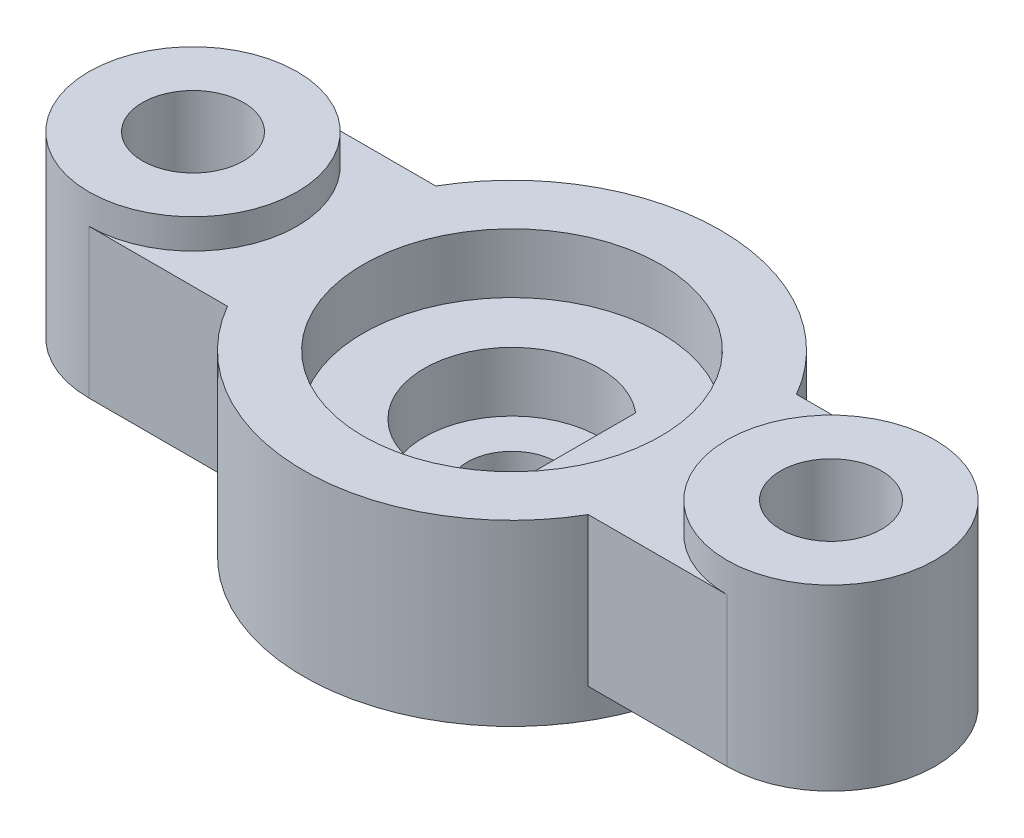
ISO-10303-21;
HEADER;
FILE_DESCRIPTION(('STEP AP214'),'2;1');
FILE_NAME('part.step','',(''),(''),'','','');
FILE_SCHEMA(('AUTOMOTIVE_DESIGN { 1 0 10303 214 1 1 1 1 }'));
ENDSEC;
DATA;
#1=APPLICATION_CONTEXT('core data for automotive mechanical design processes');
#2=APPLICATION_PROTOCOL_DEFINITION('international standard','automotive_design',2000,#1);
#3=PRODUCT_CONTEXT('',#1,'mechanical');
#4=PRODUCT('Part','Part','',(#3));
#5=PRODUCT_RELATED_PRODUCT_CATEGORY('part','',(#4));
#6=PRODUCT_DEFINITION_FORMATION('','',#4);
#7=PRODUCT_DEFINITION_CONTEXT('part definition',#1,'design');
#8=PRODUCT_DEFINITION('design','',#6,#7);
#9=PRODUCT_DEFINITION_SHAPE('','',#8);
#10=(LENGTH_UNIT() NAMED_UNIT(*) SI_UNIT(.MILLI.,.METRE.));
#11=(NAMED_UNIT(*) PLANE_ANGLE_UNIT() SI_UNIT($,.RADIAN.));
#12=(NAMED_UNIT(*) SI_UNIT($,.STERADIAN.) SOLID_ANGLE_UNIT());
#13=UNCERTAINTY_MEASURE_WITH_UNIT(LENGTH_MEASURE(1.E-05),#10,'distance_accuracy_value','');
#14=(GEOMETRIC_REPRESENTATION_CONTEXT(3) GLOBAL_UNCERTAINTY_ASSIGNED_CONTEXT((#13)) GLOBAL_UNIT_ASSIGNED_CONTEXT((#10,
#11,#12)) REPRESENTATION_CONTEXT('',''));
#15=CARTESIAN_POINT('',(0.,0.,0.));
#16=DIRECTION('',(0.,0.,1.));
#17=DIRECTION('',(1.,0.,0.));
#18=AXIS2_PLACEMENT_3D('',#15,#16,#17);
#19=CARTESIAN_POINT('',(0.,3.,0.));
#20=DIRECTION('',(0.,-1.,0.));
#21=DIRECTION('',(0.,0.,-1.));
#22=AXIS2_PLACEMENT_3D('',#19,#20,#21);
#23=CYLINDRICAL_SURFACE('',#22,1.5);
#24=CARTESIAN_POINT('',(0.,-1.,0.));
#25=DIRECTION('',(0.,-1.,0.));
#26=DIRECTION('',(0.,0.,-1.));
#27=AXIS2_PLACEMENT_3D('',#24,#25,#26);
#28=CIRCLE('',#27,1.5);
#29=CARTESIAN_POINT('',(0.,-1.,-1.5));
#30=VERTEX_POINT('',#29);
#31=EDGE_CURVE('E168',#30,#30,#28,.T.);
#32=ORIENTED_EDGE('',*,*,#31,.T.);
#33=EDGE_LOOP('',(#32));
#34=FACE_BOUND('',#33,.T.);
#35=CARTESIAN_POINT('',(0.,1.,0.));
#36=DIRECTION('',(0.,1.,0.));
#37=DIRECTION('',(0.,0.,1.));
#38=AXIS2_PLACEMENT_3D('',#35,#36,#37);
#39=CIRCLE('',#38,1.5);
#40=CARTESIAN_POINT('',(0.,1.,1.5));
#41=VERTEX_POINT('',#40);
#42=EDGE_CURVE('E37',#41,#41,#39,.F.);
#43=ORIENTED_EDGE('',*,*,#42,.F.);
#44=EDGE_LOOP('',(#43));
#45=FACE_BOUND('',#44,.T.);
#46=ADVANCED_FACE('F33',(#34,#45),#23,.F.);
#47=CARTESIAN_POINT('',(0.,0.,0.));
#48=DIRECTION('',(0.,1.,0.));
#49=DIRECTION('',(0.,0.,1.));
#50=AXIS2_PLACEMENT_3D('',#47,#48,#49);
#51=PLANE('',#50);
#52=CARTESIAN_POINT('',(10.72,0.,0.));
#53=DIRECTION('',(0.,1.,0.));
#54=DIRECTION('',(0.,0.,1.));
#55=AXIS2_PLACEMENT_3D('',#52,#53,#54);
#56=CIRCLE('',#55,1.7);
#57=CARTESIAN_POINT('',(10.72,0.,1.7));
#58=VERTEX_POINT('',#57);
#59=EDGE_CURVE('E196',#58,#58,#56,.T.);
#60=ORIENTED_EDGE('',*,*,#59,.T.);
#61=EDGE_LOOP('',(#60));
#62=FACE_BOUND('',#61,.T.);
#63=DIRECTION('',(1.,0.,0.));
#64=VECTOR('',#63,1.);
#65=CARTESIAN_POINT('',(10.72,0.,3.5));
#66=LINE('',#65,#64);
#67=CARTESIAN_POINT('',(6.06217782649107,0.,3.5));
#68=VERTEX_POINT('',#67);
#69=CARTESIAN_POINT('',(10.72,0.,3.5));
#70=VERTEX_POINT('',#69);
#71=EDGE_CURVE('E135',#68,#70,#66,.T.);
#72=ORIENTED_EDGE('',*,*,#71,.F.);
#73=CARTESIAN_POINT('',(0.,0.,0.));
#74=DIRECTION('',(0.,1.,0.));
#75=DIRECTION('',(0.,0.,1.));
#76=AXIS2_PLACEMENT_3D('',#73,#74,#75);
#77=CIRCLE('',#76,7.);
#78=CARTESIAN_POINT('',(6.06217782649107,0.,-3.5));
#79=VERTEX_POINT('',#78);
#80=EDGE_CURVE('E161',#68,#79,#77,.T.);
#81=ORIENTED_EDGE('',*,*,#80,.T.);
#82=DIRECTION('',(-1.,0.,0.));
#83=VECTOR('',#82,1.);
#84=CARTESIAN_POINT('',(10.72,0.,-3.5));
#85=LINE('',#84,#83);
#86=CARTESIAN_POINT('',(10.72,0.,-3.5));
#87=VERTEX_POINT('',#86);
#88=EDGE_CURVE('E140',#87,#79,#85,.T.);
#89=ORIENTED_EDGE('',*,*,#88,.F.);
#90=CARTESIAN_POINT('',(10.72,0.,0.));
#91=DIRECTION('',(0.,1.,0.));
#92=DIRECTION('',(0.,0.,1.));
#93=AXIS2_PLACEMENT_3D('',#90,#91,#92);
#94=CIRCLE('',#93,3.5);
#95=EDGE_CURVE('E137',#70,#87,#94,.T.);
#96=ORIENTED_EDGE('',*,*,#95,.F.);
#97=EDGE_LOOP('',(#72,#81,#89,#96));
#98=FACE_BOUND('',#97,.T.);
#99=ADVANCED_FACE('F216',(#62,#98),#51,.F.);
#100=CARTESIAN_POINT('',(0.,5.,0.));
#101=DIRECTION('',(0.,-1.,0.));
#102=DIRECTION('',(0.,0.,-1.));
#103=AXIS2_PLACEMENT_3D('',#100,#101,#102);
#104=CYLINDRICAL_SURFACE('',#103,5.);
#105=CARTESIAN_POINT('',(0.,5.,0.));
#106=DIRECTION('',(0.,1.,0.));
#107=DIRECTION('',(0.,0.,1.));
#108=AXIS2_PLACEMENT_3D('',#105,#106,#107);
#109=CIRCLE('',#108,5.);
#110=CARTESIAN_POINT('',(0.,5.,5.));
#111=VERTEX_POINT('',#110);
#112=EDGE_CURVE('E138',#111,#111,#109,.T.);
#113=ORIENTED_EDGE('',*,*,#112,.T.);
#114=EDGE_LOOP('',(#113));
#115=FACE_BOUND('',#114,.T.);
#116=CARTESIAN_POINT('',(0.,3.,0.));
#117=DIRECTION('',(0.,-1.,0.));
#118=DIRECTION('',(0.,0.,-1.));
#119=AXIS2_PLACEMENT_3D('',#116,#117,#118);
#120=CIRCLE('',#119,5.);
#121=CARTESIAN_POINT('',(0.,3.,-5.));
#122=VERTEX_POINT('',#121);
#123=EDGE_CURVE('E159',#122,#122,#120,.T.);
#124=ORIENTED_EDGE('',*,*,#123,.T.);
#125=EDGE_LOOP('',(#124));
#126=FACE_BOUND('',#125,.T.);
#127=ADVANCED_FACE('F258',(#115,#126),#104,.F.);
#128=CARTESIAN_POINT('',(0.,5.,0.));
#129=DIRECTION('',(0.,1.,0.));
#130=DIRECTION('',(0.,0.,1.));
#131=AXIS2_PLACEMENT_3D('',#128,#129,#130);
#132=PLANE('',#131);
#133=ORIENTED_EDGE('',*,*,#112,.F.);
#134=EDGE_LOOP('',(#133));
#135=FACE_BOUND('',#134,.T.);
#136=DIRECTION('',(1.,0.,0.));
#137=VECTOR('',#136,1.);
#138=CARTESIAN_POINT('',(10.72,5.,3.5));
#139=LINE('',#138,#137);
#140=CARTESIAN_POINT('',(6.06217782649107,5.,3.5));
#141=VERTEX_POINT('',#140);
#142=CARTESIAN_POINT('',(10.72,5.,3.5));
#143=VERTEX_POINT('',#142);
#144=EDGE_CURVE('E92',#141,#143,#139,.T.);
#145=ORIENTED_EDGE('',*,*,#144,.T.);
#146=CARTESIAN_POINT('',(10.72,5.,0.));
#147=DIRECTION('',(0.,1.,0.));
#148=DIRECTION('',(0.,0.,1.));
#149=AXIS2_PLACEMENT_3D('',#146,#147,#148);
#150=CIRCLE('',#149,3.5);
#151=CARTESIAN_POINT('',(10.72,5.,-3.5));
#152=VERTEX_POINT('',#151);
#153=EDGE_CURVE('E179',#152,#143,#150,.T.);
#154=ORIENTED_EDGE('',*,*,#153,.F.);
#155=DIRECTION('',(-1.,0.,0.));
#156=VECTOR('',#155,1.);
#157=CARTESIAN_POINT('',(10.72,5.,-3.5));
#158=LINE('',#157,#156);
#159=CARTESIAN_POINT('',(6.06217782649107,5.,-3.5));
#160=VERTEX_POINT('',#159);
#161=EDGE_CURVE('E109',#152,#160,#158,.T.);
#162=ORIENTED_EDGE('',*,*,#161,.T.);
#163=CARTESIAN_POINT('',(0.,5.,0.));
#164=DIRECTION('',(0.,1.,0.));
#165=DIRECTION('',(0.,0.,1.));
#166=AXIS2_PLACEMENT_3D('',#163,#164,#165);
#167=CIRCLE('',#166,7.);
#168=CARTESIAN_POINT('',(-6.06217782649107,5.,-3.5));
#169=VERTEX_POINT('',#168);
#170=EDGE_CURVE('E101',#160,#169,#167,.T.);
#171=ORIENTED_EDGE('',*,*,#170,.T.);
#172=DIRECTION('',(-1.,0.,0.));
#173=VECTOR('',#172,1.);
#174=CARTESIAN_POINT('',(-10.72,5.,-3.5));
#175=LINE('',#174,#173);
#176=CARTESIAN_POINT('',(-10.72,5.,-3.5));
#177=VERTEX_POINT('',#176);
#178=EDGE_CURVE('E105',#169,#177,#175,.T.);
#179=ORIENTED_EDGE('',*,*,#178,.T.);
#180=CARTESIAN_POINT('',(-10.72,5.,0.));
#181=DIRECTION('',(0.,1.,0.));
#182=DIRECTION('',(0.,0.,1.));
#183=AXIS2_PLACEMENT_3D('',#180,#181,#182);
#184=CIRCLE('',#183,3.5);
#185=CARTESIAN_POINT('',(-10.72,5.,3.5));
#186=VERTEX_POINT('',#185);
#187=EDGE_CURVE('E188',#186,#177,#184,.T.);
#188=ORIENTED_EDGE('',*,*,#187,.F.);
#189=DIRECTION('',(1.,0.,0.));
#190=VECTOR('',#189,1.);
#191=CARTESIAN_POINT('',(-10.72,5.,3.5));
#192=LINE('',#191,#190);
#193=CARTESIAN_POINT('',(-6.06217782649107,5.,3.5));
#194=VERTEX_POINT('',#193);
#195=EDGE_CURVE('E59',#186,#194,#192,.T.);
#196=ORIENTED_EDGE('',*,*,#195,.T.);
#197=CARTESIAN_POINT('',(0.,5.,0.));
#198=DIRECTION('',(0.,1.,0.));
#199=DIRECTION('',(0.,0.,1.));
#200=AXIS2_PLACEMENT_3D('',#197,#198,#199);
#201=CIRCLE('',#200,7.);
#202=EDGE_CURVE('E149',#194,#141,#201,.T.);
#203=ORIENTED_EDGE('',*,*,#202,.T.);
#204=EDGE_LOOP('',(#145,#154,#162,#171,#179,#188,#196,#203));
#205=FACE_BOUND('',#204,.T.);
#206=ADVANCED_FACE('F103',(#135,#205),#132,.T.);
#207=DIRECTION('',(-1.,0.,0.));
#208=VECTOR('',#207,1.);
#209=CARTESIAN_POINT('',(-10.72,0.,-3.5));
#210=LINE('',#209,#208);
#211=CARTESIAN_POINT('',(-6.06217782649107,0.,-3.5));
#212=VERTEX_POINT('',#211);
#213=CARTESIAN_POINT('',(-10.72,0.,-3.5));
#214=VERTEX_POINT('',#213);
#215=EDGE_CURVE('E143',#212,#214,#210,.T.);
#216=ORIENTED_EDGE('',*,*,#215,.F.);
#217=CARTESIAN_POINT('',(-6.06217782649107,0.,3.5));
#218=VERTEX_POINT('',#217);
#219=EDGE_CURVE('E122',#212,#218,#77,.T.);
#220=ORIENTED_EDGE('',*,*,#219,.T.);
#221=DIRECTION('',(1.,0.,0.));
#222=VECTOR('',#221,1.);
#223=CARTESIAN_POINT('',(-10.72,0.,3.5));
#224=LINE('',#223,#222);
#225=CARTESIAN_POINT('',(-10.72,0.,3.5));
#226=VERTEX_POINT('',#225);
#227=EDGE_CURVE('E146',#226,#218,#224,.T.);
#228=ORIENTED_EDGE('',*,*,#227,.F.);
#229=CARTESIAN_POINT('',(-10.72,0.,0.));
#230=DIRECTION('',(0.,1.,0.));
#231=DIRECTION('',(0.,0.,1.));
#232=AXIS2_PLACEMENT_3D('',#229,#230,#231);
#233=CIRCLE('',#232,3.5);
#234=EDGE_CURVE('E84',#214,#226,#233,.T.);
#235=ORIENTED_EDGE('',*,*,#234,.F.);
#236=EDGE_LOOP('',(#216,#220,#228,#235));
#237=FACE_BOUND('',#236,.T.);
#238=CARTESIAN_POINT('',(-10.72,0.,0.));
#239=DIRECTION('',(0.,1.,0.));
#240=DIRECTION('',(0.,0.,1.));
#241=AXIS2_PLACEMENT_3D('',#238,#239,#240);
#242=CIRCLE('',#241,1.7);
#243=CARTESIAN_POINT('',(-10.72,0.,1.7));
#244=VERTEX_POINT('',#243);
#245=EDGE_CURVE('E192',#244,#244,#242,.T.);
#246=ORIENTED_EDGE('',*,*,#245,.T.);
#247=EDGE_LOOP('',(#246));
#248=FACE_BOUND('',#247,.T.);
#249=ADVANCED_FACE('F225',(#237,#248),#51,.F.);
#250=CARTESIAN_POINT('',(10.72,5.,3.5));
#251=DIRECTION('',(0.,0.,-1.));
#252=DIRECTION('',(-1.,0.,0.));
#253=AXIS2_PLACEMENT_3D('',#250,#251,#252);
#254=PLANE('',#253);
#255=ORIENTED_EDGE('',*,*,#71,.T.);
#256=DIRECTION('',(0.,-1.,0.));
#257=VECTOR('',#256,1.);
#258=CARTESIAN_POINT('',(10.72,5.,3.5));
#259=LINE('',#258,#257);
#260=EDGE_CURVE('E42',#143,#70,#259,.T.);
#261=ORIENTED_EDGE('',*,*,#260,.F.);
#262=ORIENTED_EDGE('',*,*,#144,.F.);
#263=DIRECTION('',(0.,-1.,0.));
#264=VECTOR('',#263,1.);
#265=CARTESIAN_POINT('',(6.06217782649107,5.,3.5));
#266=LINE('',#265,#264);
#267=EDGE_CURVE('E11',#141,#68,#266,.T.);
#268=ORIENTED_EDGE('',*,*,#267,.T.);
#269=EDGE_LOOP('',(#255,#261,#262,#268));
#270=FACE_BOUND('',#269,.T.);
#271=ADVANCED_FACE('F35',(#270),#254,.F.);
#272=CARTESIAN_POINT('',(10.72,5.,0.));
#273=DIRECTION('',(0.,-1.,0.));
#274=DIRECTION('',(0.,0.,-1.));
#275=AXIS2_PLACEMENT_3D('',#272,#273,#274);
#276=CYLINDRICAL_SURFACE('',#275,3.5);
#277=ORIENTED_EDGE('',*,*,#95,.T.);
#278=DIRECTION('',(0.,-1.,0.));
#279=VECTOR('',#278,1.);
#280=CARTESIAN_POINT('',(10.72,5.,-3.5));
#281=LINE('',#280,#279);
#282=EDGE_CURVE('E155',#152,#87,#281,.T.);
#283=ORIENTED_EDGE('',*,*,#282,.F.);
#284=ORIENTED_EDGE('',*,*,#153,.T.);
#285=ORIENTED_EDGE('',*,*,#260,.T.);
#286=EDGE_LOOP('',(#277,#283,#284,#285));
#287=FACE_BOUND('',#286,.T.);
#288=CARTESIAN_POINT('',(10.72,6.,0.));
#289=DIRECTION('',(0.,1.,0.));
#290=DIRECTION('',(0.,0.,1.));
#291=AXIS2_PLACEMENT_3D('',#288,#289,#290);
#292=CIRCLE('',#291,3.5);
#293=CARTESIAN_POINT('',(10.72,6.,3.5));
#294=VERTEX_POINT('',#293);
#295=EDGE_CURVE('E180',#294,#294,#292,.T.);
#296=ORIENTED_EDGE('',*,*,#295,.F.);
#297=EDGE_LOOP('',(#296));
#298=FACE_BOUND('',#297,.T.);
#299=ADVANCED_FACE('F209',(#287,#298),#276,.T.);
#300=CARTESIAN_POINT('',(10.72,5.,-3.5));
#301=DIRECTION('',(0.,0.,1.));
#302=DIRECTION('',(1.,0.,0.));
#303=AXIS2_PLACEMENT_3D('',#300,#301,#302);
#304=PLANE('',#303);
#305=ORIENTED_EDGE('',*,*,#88,.T.);
#306=DIRECTION('',(0.,-1.,0.));
#307=VECTOR('',#306,1.);
#308=CARTESIAN_POINT('',(6.06217782649107,5.,-3.5));
#309=LINE('',#308,#307);
#310=EDGE_CURVE('E125',#160,#79,#309,.T.);
#311=ORIENTED_EDGE('',*,*,#310,.F.);
#312=ORIENTED_EDGE('',*,*,#161,.F.);
#313=ORIENTED_EDGE('',*,*,#282,.T.);
#314=EDGE_LOOP('',(#305,#311,#312,#313));
#315=FACE_BOUND('',#314,.T.);
#316=ADVANCED_FACE('F213',(#315),#304,.F.);
#317=CARTESIAN_POINT('',(0.,5.,0.));
#318=DIRECTION('',(0.,-1.,0.));
#319=DIRECTION('',(0.,0.,-1.));
#320=AXIS2_PLACEMENT_3D('',#317,#318,#319);
#321=CYLINDRICAL_SURFACE('',#320,7.);
#322=ORIENTED_EDGE('',*,*,#219,.F.);
#323=DIRECTION('',(0.,-1.,0.));
#324=VECTOR('',#323,1.);
#325=CARTESIAN_POINT('',(-6.06217782649107,5.,-3.5));
#326=LINE('',#325,#324);
#327=EDGE_CURVE('E116',#169,#212,#326,.T.);
#328=ORIENTED_EDGE('',*,*,#327,.F.);
#329=ORIENTED_EDGE('',*,*,#170,.F.);
#330=ORIENTED_EDGE('',*,*,#310,.T.);
#331=ORIENTED_EDGE('',*,*,#80,.F.);
#332=ORIENTED_EDGE('',*,*,#267,.F.);
#333=ORIENTED_EDGE('',*,*,#202,.F.);
#334=DIRECTION('',(0.,-1.,0.));
#335=VECTOR('',#334,1.);
#336=CARTESIAN_POINT('',(-6.06217782649107,5.,3.5));
#337=LINE('',#336,#335);
#338=EDGE_CURVE('E131',#194,#218,#337,.T.);
#339=ORIENTED_EDGE('',*,*,#338,.T.);
#340=EDGE_LOOP('',(#322,#328,#329,#330,#331,#332,#333,#339));
#341=FACE_BOUND('',#340,.T.);
#342=CARTESIAN_POINT('',(0.,-1.,0.));
#343=DIRECTION('',(0.,-1.,0.));
#344=DIRECTION('',(0.,0.,-1.));
#345=AXIS2_PLACEMENT_3D('',#342,#343,#344);
#346=CIRCLE('',#345,7.);
#347=CARTESIAN_POINT('',(0.,-1.,-7.));
#348=VERTEX_POINT('',#347);
#349=EDGE_CURVE('E162',#348,#348,#346,.T.);
#350=ORIENTED_EDGE('',*,*,#349,.F.);
#351=EDGE_LOOP('',(#350));
#352=FACE_BOUND('',#351,.T.);
#353=ADVANCED_FACE('F117',(#341,#352),#321,.T.);
#354=CARTESIAN_POINT('',(-10.72,5.,-3.5));
#355=DIRECTION('',(0.,0.,1.));
#356=DIRECTION('',(1.,0.,0.));
#357=AXIS2_PLACEMENT_3D('',#354,#355,#356);
#358=PLANE('',#357);
#359=ORIENTED_EDGE('',*,*,#215,.T.);
#360=DIRECTION('',(0.,-1.,0.));
#361=VECTOR('',#360,1.);
#362=CARTESIAN_POINT('',(-10.72,5.,-3.5));
#363=LINE('',#362,#361);
#364=EDGE_CURVE('E126',#177,#214,#363,.T.);
#365=ORIENTED_EDGE('',*,*,#364,.F.);
#366=ORIENTED_EDGE('',*,*,#178,.F.);
#367=ORIENTED_EDGE('',*,*,#327,.T.);
#368=EDGE_LOOP('',(#359,#365,#366,#367));
#369=FACE_BOUND('',#368,.T.);
#370=ADVANCED_FACE('F128',(#369),#358,.F.);
#371=CARTESIAN_POINT('',(-10.72,5.,0.));
#372=DIRECTION('',(0.,-1.,0.));
#373=DIRECTION('',(0.,0.,-1.));
#374=AXIS2_PLACEMENT_3D('',#371,#372,#373);
#375=CYLINDRICAL_SURFACE('',#374,3.5);
#376=ORIENTED_EDGE('',*,*,#234,.T.);
#377=DIRECTION('',(0.,-1.,0.));
#378=VECTOR('',#377,1.);
#379=CARTESIAN_POINT('',(-10.72,5.,3.5));
#380=LINE('',#379,#378);
#381=EDGE_CURVE('E151',#186,#226,#380,.T.);
#382=ORIENTED_EDGE('',*,*,#381,.F.);
#383=ORIENTED_EDGE('',*,*,#187,.T.);
#384=ORIENTED_EDGE('',*,*,#364,.T.);
#385=EDGE_LOOP('',(#376,#382,#383,#384));
#386=FACE_BOUND('',#385,.T.);
#387=CARTESIAN_POINT('',(-10.72,6.,0.));
#388=DIRECTION('',(0.,1.,0.));
#389=DIRECTION('',(0.,0.,1.));
#390=AXIS2_PLACEMENT_3D('',#387,#388,#389);
#391=CIRCLE('',#390,3.5);
#392=CARTESIAN_POINT('',(-10.72,6.,3.5));
#393=VERTEX_POINT('',#392);
#394=EDGE_CURVE('E189',#393,#393,#391,.T.);
#395=ORIENTED_EDGE('',*,*,#394,.F.);
#396=EDGE_LOOP('',(#395));
#397=FACE_BOUND('',#396,.T.);
#398=ADVANCED_FACE('F228',(#386,#397),#375,.T.);
#399=CARTESIAN_POINT('',(-10.72,5.,3.5));
#400=DIRECTION('',(0.,0.,-1.));
#401=DIRECTION('',(-1.,0.,0.));
#402=AXIS2_PLACEMENT_3D('',#399,#400,#401);
#403=PLANE('',#402);
#404=ORIENTED_EDGE('',*,*,#227,.T.);
#405=ORIENTED_EDGE('',*,*,#338,.F.);
#406=ORIENTED_EDGE('',*,*,#195,.F.);
#407=ORIENTED_EDGE('',*,*,#381,.T.);
#408=EDGE_LOOP('',(#404,#405,#406,#407));
#409=FACE_BOUND('',#408,.T.);
#410=ADVANCED_FACE('F227',(#409),#403,.F.);
#411=CARTESIAN_POINT('',(10.72,5.,0.));
#412=DIRECTION('',(0.,-1.,0.));
#413=DIRECTION('',(0.,0.,-1.));
#414=AXIS2_PLACEMENT_3D('',#411,#412,#413);
#415=CYLINDRICAL_SURFACE('',#414,1.7);
#416=ORIENTED_EDGE('',*,*,#59,.F.);
#417=EDGE_LOOP('',(#416));
#418=FACE_BOUND('',#417,.T.);
#419=CARTESIAN_POINT('',(10.72,6.,0.));
#420=DIRECTION('',(0.,1.,0.));
#421=DIRECTION('',(0.,0.,1.));
#422=AXIS2_PLACEMENT_3D('',#419,#420,#421);
#423=CIRCLE('',#422,1.7);
#424=CARTESIAN_POINT('',(10.72,6.,1.7));
#425=VERTEX_POINT('',#424);
#426=EDGE_CURVE('E176',#425,#425,#423,.T.);
#427=ORIENTED_EDGE('',*,*,#426,.T.);
#428=EDGE_LOOP('',(#427));
#429=FACE_BOUND('',#428,.T.);
#430=ADVANCED_FACE('F243',(#418,#429),#415,.F.);
#431=CARTESIAN_POINT('',(-10.72,5.,0.));
#432=DIRECTION('',(0.,-1.,0.));
#433=DIRECTION('',(0.,0.,-1.));
#434=AXIS2_PLACEMENT_3D('',#431,#432,#433);
#435=CYLINDRICAL_SURFACE('',#434,1.7);
#436=ORIENTED_EDGE('',*,*,#245,.F.);
#437=EDGE_LOOP('',(#436));
#438=FACE_BOUND('',#437,.T.);
#439=CARTESIAN_POINT('',(-10.72,6.,0.));
#440=DIRECTION('',(0.,1.,0.));
#441=DIRECTION('',(0.,0.,1.));
#442=AXIS2_PLACEMENT_3D('',#439,#440,#441);
#443=CIRCLE('',#442,1.7);
#444=CARTESIAN_POINT('',(-10.72,6.,1.7));
#445=VERTEX_POINT('',#444);
#446=EDGE_CURVE('E183',#445,#445,#443,.T.);
#447=ORIENTED_EDGE('',*,*,#446,.T.);
#448=EDGE_LOOP('',(#447));
#449=FACE_BOUND('',#448,.T.);
#450=ADVANCED_FACE('F238',(#438,#449),#435,.F.);
#451=CARTESIAN_POINT('',(-10.72,6.,0.));
#452=DIRECTION('',(0.,1.,0.));
#453=DIRECTION('',(0.,0.,1.));
#454=AXIS2_PLACEMENT_3D('',#451,#452,#453);
#455=PLANE('',#454);
#456=ORIENTED_EDGE('',*,*,#394,.T.);
#457=EDGE_LOOP('',(#456));
#458=FACE_BOUND('',#457,.T.);
#459=ORIENTED_EDGE('',*,*,#446,.F.);
#460=EDGE_LOOP('',(#459));
#461=FACE_BOUND('',#460,.T.);
#462=ADVANCED_FACE('F234',(#458,#461),#455,.T.);
#463=CARTESIAN_POINT('',(10.72,6.,0.));
#464=DIRECTION('',(0.,1.,0.));
#465=DIRECTION('',(0.,0.,1.));
#466=AXIS2_PLACEMENT_3D('',#463,#464,#465);
#467=PLANE('',#466);
#468=ORIENTED_EDGE('',*,*,#295,.T.);
#469=EDGE_LOOP('',(#468));
#470=FACE_BOUND('',#469,.T.);
#471=ORIENTED_EDGE('',*,*,#426,.F.);
#472=EDGE_LOOP('',(#471));
#473=FACE_BOUND('',#472,.T.);
#474=ADVANCED_FACE('F237',(#470,#473),#467,.T.);
#475=CARTESIAN_POINT('',(0.,3.,0.));
#476=DIRECTION('',(0.,-1.,0.));
#477=DIRECTION('',(0.,0.,-1.));
#478=AXIS2_PLACEMENT_3D('',#475,#476,#477);
#479=PLANE('',#478);
#480=DIRECTION('',(0.,0.,-1.));
#481=VECTOR('',#480,1.);
#482=CARTESIAN_POINT('',(1.9,3.,-2.25665681927935));
#483=LINE('',#482,#481);
#484=CARTESIAN_POINT('',(1.9,3.,2.25665681927935));
#485=VERTEX_POINT('',#484);
#486=CARTESIAN_POINT('',(1.9,3.,-2.25665681927935));
#487=VERTEX_POINT('',#486);
#488=EDGE_CURVE('E396',#485,#487,#483,.T.);
#489=ORIENTED_EDGE('',*,*,#488,.F.);
#490=CARTESIAN_POINT('',(0.,3.,0.));
#491=DIRECTION('',(0.,1.,0.));
#492=DIRECTION('',(0.,0.,1.));
#493=AXIS2_PLACEMENT_3D('',#490,#491,#492);
#494=CIRCLE('',#493,2.95);
#495=EDGE_CURVE('E50',#487,#485,#494,.T.);
#496=ORIENTED_EDGE('',*,*,#495,.F.);
#497=EDGE_LOOP('',(#489,#496));
#498=FACE_BOUND('',#497,.T.);
#499=ORIENTED_EDGE('',*,*,#123,.F.);
#500=EDGE_LOOP('',(#499));
#501=FACE_BOUND('',#500,.T.);
#502=ADVANCED_FACE('F266',(#498,#501),#479,.F.);
#503=CARTESIAN_POINT('',(0.,-1.,0.));
#504=DIRECTION('',(0.,-1.,0.));
#505=DIRECTION('',(0.,0.,-1.));
#506=AXIS2_PLACEMENT_3D('',#503,#504,#505);
#507=PLANE('',#506);
#508=ORIENTED_EDGE('',*,*,#349,.T.);
#509=EDGE_LOOP('',(#508));
#510=FACE_BOUND('',#509,.T.);
#511=ORIENTED_EDGE('',*,*,#31,.F.);
#512=EDGE_LOOP('',(#511));
#513=FACE_BOUND('',#512,.T.);
#514=ADVANCED_FACE('F264',(#510,#513),#507,.T.);
#515=CARTESIAN_POINT('',(0.,1.,0.));
#516=DIRECTION('',(0.,1.,0.));
#517=DIRECTION('',(0.,0.,1.));
#518=AXIS2_PLACEMENT_3D('',#515,#516,#517);
#519=PLANE('',#518);
#520=CARTESIAN_POINT('',(0.,1.,0.));
#521=DIRECTION('',(0.,1.,0.));
#522=DIRECTION('',(0.,0.,1.));
#523=AXIS2_PLACEMENT_3D('',#520,#521,#522);
#524=CIRCLE('',#523,2.95);
#525=CARTESIAN_POINT('',(1.9,1.,-2.25665681927935));
#526=VERTEX_POINT('',#525);
#527=CARTESIAN_POINT('',(1.9,1.,2.25665681927935));
#528=VERTEX_POINT('',#527);
#529=EDGE_CURVE('E403',#526,#528,#524,.T.);
#530=ORIENTED_EDGE('',*,*,#529,.T.);
#531=DIRECTION('',(0.,0.,-1.));
#532=VECTOR('',#531,1.);
#533=CARTESIAN_POINT('',(1.9,1.,-2.25665681927935));
#534=LINE('',#533,#532);
#535=EDGE_CURVE('E408',#528,#526,#534,.T.);
#536=ORIENTED_EDGE('',*,*,#535,.T.);
#537=EDGE_LOOP('',(#530,#536));
#538=FACE_BOUND('',#537,.T.);
#539=ORIENTED_EDGE('',*,*,#42,.T.);
#540=EDGE_LOOP('',(#539));
#541=FACE_BOUND('',#540,.T.);
#542=ADVANCED_FACE('F352',(#538,#541),#519,.T.);
#543=CARTESIAN_POINT('',(0.,1.,0.));
#544=DIRECTION('',(0.,1.,0.));
#545=DIRECTION('',(0.,0.,1.));
#546=AXIS2_PLACEMENT_3D('',#543,#544,#545);
#547=CYLINDRICAL_SURFACE('',#546,2.95);
#548=ORIENTED_EDGE('',*,*,#495,.T.);
#549=DIRECTION('',(0.,1.,0.));
#550=VECTOR('',#549,1.);
#551=CARTESIAN_POINT('',(1.9,1.,2.25665681927935));
#552=LINE('',#551,#550);
#553=EDGE_CURVE('E400',#528,#485,#552,.T.);
#554=ORIENTED_EDGE('',*,*,#553,.F.);
#555=ORIENTED_EDGE('',*,*,#529,.F.);
#556=DIRECTION('',(0.,1.,0.));
#557=VECTOR('',#556,1.);
#558=CARTESIAN_POINT('',(1.9,1.,-2.25665681927935));
#559=LINE('',#558,#557);
#560=EDGE_CURVE('E398',#526,#487,#559,.T.);
#561=ORIENTED_EDGE('',*,*,#560,.T.);
#562=EDGE_LOOP('',(#548,#554,#555,#561));
#563=FACE_BOUND('',#562,.T.);
#564=ADVANCED_FACE('F370',(#563),#547,.F.);
#565=CARTESIAN_POINT('',(1.9,1.,-2.25665681927935));
#566=DIRECTION('',(1.,0.,0.));
#567=DIRECTION('',(0.,0.,-1.));
#568=AXIS2_PLACEMENT_3D('',#565,#566,#567);
#569=PLANE('',#568);
#570=ORIENTED_EDGE('',*,*,#488,.T.);
#571=ORIENTED_EDGE('',*,*,#560,.F.);
#572=ORIENTED_EDGE('',*,*,#535,.F.);
#573=ORIENTED_EDGE('',*,*,#553,.T.);
#574=EDGE_LOOP('',(#570,#571,#572,#573));
#575=FACE_BOUND('',#574,.T.);
#576=ADVANCED_FACE('F380',(#575),#569,.F.);
#577=CLOSED_SHELL('',(#46,#99,#127,#206,#249,#271,#299,#316,#353,#370,#398,#410,#430,#450,#462,
#474,#502,#514,#542,#564,#576));
#578=MANIFOLD_SOLID_BREP('B2',#577);
#579=ADVANCED_BREP_SHAPE_REPRESENTATION('',(#18,#578),#14);
#580=SHAPE_DEFINITION_REPRESENTATION(#9,#579);
ENDSEC;
END-ISO-10303-21;
